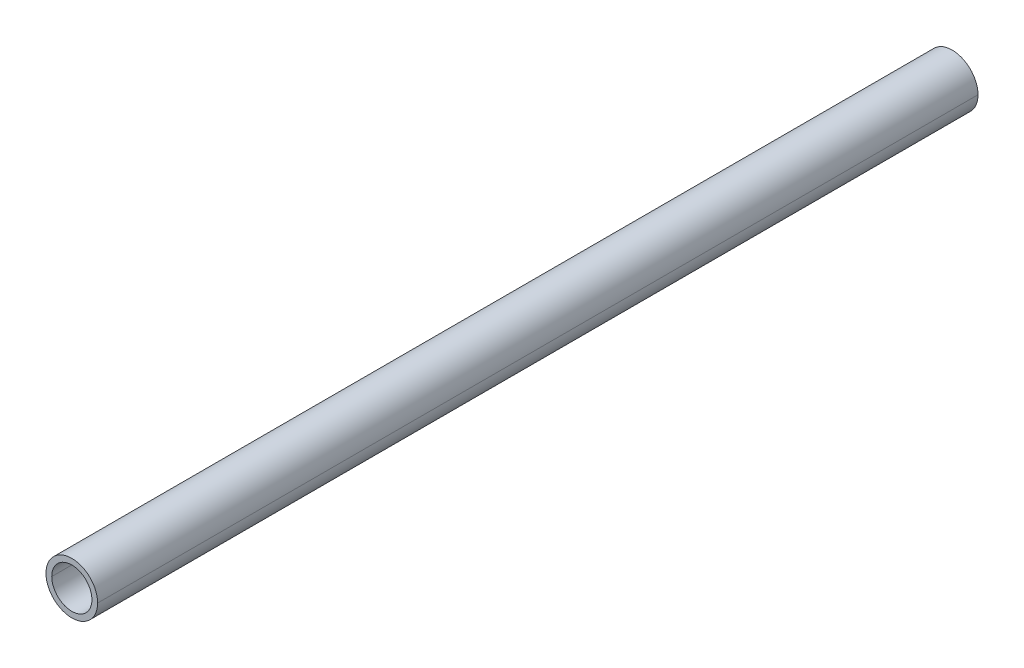
ISO-10303-21;
HEADER;
FILE_DESCRIPTION(('STEP AP214'),'2;1');
FILE_NAME('part.step','',(''),(''),'','','');
FILE_SCHEMA(('AUTOMOTIVE_DESIGN { 1 0 10303 214 1 1 1 1 }'));
ENDSEC;
DATA;
#1=APPLICATION_CONTEXT('core data for automotive mechanical design processes');
#2=APPLICATION_PROTOCOL_DEFINITION('international standard','automotive_design',2000,#1);
#3=PRODUCT_CONTEXT('',#1,'mechanical');
#4=PRODUCT('Part','Part','',(#3));
#5=PRODUCT_RELATED_PRODUCT_CATEGORY('part','',(#4));
#6=PRODUCT_DEFINITION_FORMATION('','',#4);
#7=PRODUCT_DEFINITION_CONTEXT('part definition',#1,'design');
#8=PRODUCT_DEFINITION('design','',#6,#7);
#9=PRODUCT_DEFINITION_SHAPE('','',#8);
#10=(LENGTH_UNIT() NAMED_UNIT(*) SI_UNIT(.MILLI.,.METRE.));
#11=(NAMED_UNIT(*) PLANE_ANGLE_UNIT() SI_UNIT($,.RADIAN.));
#12=(NAMED_UNIT(*) SI_UNIT($,.STERADIAN.) SOLID_ANGLE_UNIT());
#13=UNCERTAINTY_MEASURE_WITH_UNIT(LENGTH_MEASURE(1.E-05),#10,'distance_accuracy_value','');
#14=(GEOMETRIC_REPRESENTATION_CONTEXT(3) GLOBAL_UNCERTAINTY_ASSIGNED_CONTEXT((#13)) GLOBAL_UNIT_ASSIGNED_CONTEXT((#10,
#11,#12)) REPRESENTATION_CONTEXT('',''));
#15=CARTESIAN_POINT('',(0.,0.,0.));
#16=DIRECTION('',(0.,0.,1.));
#17=DIRECTION('',(1.,0.,0.));
#18=AXIS2_PLACEMENT_3D('',#15,#16,#17);
#19=CARTESIAN_POINT('',(0.,0.,306.9));
#20=DIRECTION('',(0.,0.,-1.));
#21=DIRECTION('',(-1.,0.,0.));
#22=AXIS2_PLACEMENT_3D('',#19,#20,#21);
#23=CYLINDRICAL_SURFACE('',#22,7.);
#24=DIRECTION('',(0.,0.,-1.));
#25=VECTOR('',#24,1.);
#26=CARTESIAN_POINT('',(7.,0.,306.9));
#27=LINE('',#26,#25);
#28=CARTESIAN_POINT('',(7.,0.,306.9));
#29=VERTEX_POINT('',#28);
#30=CARTESIAN_POINT('',(7.,0.,0.));
#31=VERTEX_POINT('',#30);
#32=EDGE_CURVE('E76',#29,#31,#27,.T.);
#33=ORIENTED_EDGE('',*,*,#32,.F.);
#34=CARTESIAN_POINT('',(0.,0.,306.9));
#35=DIRECTION('',(0.,0.,1.));
#36=DIRECTION('',(1.,0.,0.));
#37=AXIS2_PLACEMENT_3D('',#34,#35,#36);
#38=CIRCLE('',#37,7.);
#39=CARTESIAN_POINT('',(-7.,0.,306.9));
#40=VERTEX_POINT('',#39);
#41=EDGE_CURVE('E65',#29,#40,#38,.T.);
#42=ORIENTED_EDGE('',*,*,#41,.T.);
#43=DIRECTION('',(0.,0.,-1.));
#44=VECTOR('',#43,1.);
#45=CARTESIAN_POINT('',(-7.,0.,306.9));
#46=LINE('',#45,#44);
#47=CARTESIAN_POINT('',(-7.,0.,0.));
#48=VERTEX_POINT('',#47);
#49=EDGE_CURVE('E73',#40,#48,#46,.T.);
#50=ORIENTED_EDGE('',*,*,#49,.T.);
#51=CARTESIAN_POINT('',(0.,0.,0.));
#52=DIRECTION('',(0.,0.,1.));
#53=DIRECTION('',(1.,0.,0.));
#54=AXIS2_PLACEMENT_3D('',#51,#52,#53);
#55=CIRCLE('',#54,7.);
#56=EDGE_CURVE('E11',#31,#48,#55,.T.);
#57=ORIENTED_EDGE('',*,*,#56,.F.);
#58=EDGE_LOOP('',(#33,#42,#50,#57));
#59=FACE_BOUND('',#58,.T.);
#60=ADVANCED_FACE('F16',(#59),#23,.F.);
#61=CARTESIAN_POINT('',(0.,0.,306.9));
#62=DIRECTION('',(0.,0.,-1.));
#63=DIRECTION('',(-1.,0.,0.));
#64=AXIS2_PLACEMENT_3D('',#61,#62,#63);
#65=CYLINDRICAL_SURFACE('',#64,9.);
#66=DIRECTION('',(0.,0.,-1.));
#67=VECTOR('',#66,1.);
#68=CARTESIAN_POINT('',(9.,0.,306.9));
#69=LINE('',#68,#67);
#70=CARTESIAN_POINT('',(9.,0.,306.9));
#71=VERTEX_POINT('',#70);
#72=CARTESIAN_POINT('',(9.,0.,0.));
#73=VERTEX_POINT('',#72);
#74=EDGE_CURVE('E103',#71,#73,#69,.T.);
#75=ORIENTED_EDGE('',*,*,#74,.F.);
#76=CARTESIAN_POINT('',(0.,0.,306.9));
#77=DIRECTION('',(0.,0.,1.));
#78=DIRECTION('',(1.,0.,0.));
#79=AXIS2_PLACEMENT_3D('',#76,#77,#78);
#80=CIRCLE('',#79,9.);
#81=CARTESIAN_POINT('',(-9.,0.,306.9));
#82=VERTEX_POINT('',#81);
#83=EDGE_CURVE('E20',#82,#71,#80,.T.);
#84=ORIENTED_EDGE('',*,*,#83,.F.);
#85=DIRECTION('',(0.,0.,-1.));
#86=VECTOR('',#85,1.);
#87=CARTESIAN_POINT('',(-9.,0.,306.9));
#88=LINE('',#87,#86);
#89=CARTESIAN_POINT('',(-9.,0.,0.));
#90=VERTEX_POINT('',#89);
#91=EDGE_CURVE('E99',#82,#90,#88,.T.);
#92=ORIENTED_EDGE('',*,*,#91,.T.);
#93=CARTESIAN_POINT('',(0.,0.,0.));
#94=DIRECTION('',(0.,0.,1.));
#95=DIRECTION('',(1.,0.,0.));
#96=AXIS2_PLACEMENT_3D('',#93,#94,#95);
#97=CIRCLE('',#96,9.);
#98=EDGE_CURVE('E27',#90,#73,#97,.T.);
#99=ORIENTED_EDGE('',*,*,#98,.T.);
#100=EDGE_LOOP('',(#75,#84,#92,#99));
#101=FACE_BOUND('',#100,.T.);
#102=ADVANCED_FACE('F198',(#101),#65,.T.);
#103=CARTESIAN_POINT('',(0.,0.,0.));
#104=DIRECTION('',(0.,0.,1.));
#105=DIRECTION('',(1.,0.,0.));
#106=AXIS2_PLACEMENT_3D('',#103,#104,#105);
#107=PLANE('',#106);
#108=CARTESIAN_POINT('',(0.,0.,0.));
#109=DIRECTION('',(0.,0.,1.));
#110=DIRECTION('',(1.,0.,0.));
#111=AXIS2_PLACEMENT_3D('',#108,#109,#110);
#112=CIRCLE('',#111,7.);
#113=EDGE_CURVE('E84',#48,#31,#112,.T.);
#114=ORIENTED_EDGE('',*,*,#113,.T.);
#115=ORIENTED_EDGE('',*,*,#56,.T.);
#116=EDGE_LOOP('',(#114,#115));
#117=FACE_BOUND('',#116,.T.);
#118=ORIENTED_EDGE('',*,*,#98,.F.);
#119=CARTESIAN_POINT('',(0.,0.,0.));
#120=DIRECTION('',(0.,0.,1.));
#121=DIRECTION('',(1.,0.,0.));
#122=AXIS2_PLACEMENT_3D('',#119,#120,#121);
#123=CIRCLE('',#122,9.);
#124=EDGE_CURVE('E101',#73,#90,#123,.T.);
#125=ORIENTED_EDGE('',*,*,#124,.F.);
#126=EDGE_LOOP('',(#118,#125));
#127=FACE_BOUND('',#126,.T.);
#128=ADVANCED_FACE('F194',(#117,#127),#107,.F.);
#129=CARTESIAN_POINT('',(0.,0.,306.9));
#130=DIRECTION('',(0.,0.,1.));
#131=DIRECTION('',(1.,0.,0.));
#132=AXIS2_PLACEMENT_3D('',#129,#130,#131);
#133=PLANE('',#132);
#134=CARTESIAN_POINT('',(0.,0.,306.9));
#135=DIRECTION('',(0.,0.,1.));
#136=DIRECTION('',(1.,0.,0.));
#137=AXIS2_PLACEMENT_3D('',#134,#135,#136);
#138=CIRCLE('',#137,7.);
#139=EDGE_CURVE('E82',#40,#29,#138,.T.);
#140=ORIENTED_EDGE('',*,*,#139,.F.);
#141=ORIENTED_EDGE('',*,*,#41,.F.);
#142=EDGE_LOOP('',(#140,#141));
#143=FACE_BOUND('',#142,.T.);
#144=ORIENTED_EDGE('',*,*,#83,.T.);
#145=CARTESIAN_POINT('',(0.,0.,306.9));
#146=DIRECTION('',(0.,0.,1.));
#147=DIRECTION('',(1.,0.,0.));
#148=AXIS2_PLACEMENT_3D('',#145,#146,#147);
#149=CIRCLE('',#148,9.);
#150=EDGE_CURVE('E86',#71,#82,#149,.T.);
#151=ORIENTED_EDGE('',*,*,#150,.T.);
#152=EDGE_LOOP('',(#144,#151));
#153=FACE_BOUND('',#152,.T.);
#154=ADVANCED_FACE('F88',(#143,#153),#133,.T.);
#155=CARTESIAN_POINT('',(0.,0.,306.9));
#156=DIRECTION('',(0.,0.,-1.));
#157=DIRECTION('',(-1.,0.,0.));
#158=AXIS2_PLACEMENT_3D('',#155,#156,#157);
#159=CYLINDRICAL_SURFACE('',#158,9.);
#160=ORIENTED_EDGE('',*,*,#150,.F.);
#161=ORIENTED_EDGE('',*,*,#74,.T.);
#162=ORIENTED_EDGE('',*,*,#124,.T.);
#163=ORIENTED_EDGE('',*,*,#91,.F.);
#164=EDGE_LOOP('',(#160,#161,#162,#163));
#165=FACE_BOUND('',#164,.T.);
#166=ADVANCED_FACE('F18',(#165),#159,.T.);
#167=CARTESIAN_POINT('',(0.,0.,306.9));
#168=DIRECTION('',(0.,0.,-1.));
#169=DIRECTION('',(-1.,0.,0.));
#170=AXIS2_PLACEMENT_3D('',#167,#168,#169);
#171=CYLINDRICAL_SURFACE('',#170,7.);
#172=ORIENTED_EDGE('',*,*,#139,.T.);
#173=ORIENTED_EDGE('',*,*,#32,.T.);
#174=ORIENTED_EDGE('',*,*,#113,.F.);
#175=ORIENTED_EDGE('',*,*,#49,.F.);
#176=EDGE_LOOP('',(#172,#173,#174,#175));
#177=FACE_BOUND('',#176,.T.);
#178=ADVANCED_FACE('F81',(#177),#171,.F.);
#179=CLOSED_SHELL('',(#60,#102,#128,#154,#166,#178));
#180=MANIFOLD_SOLID_BREP('B1',#179);
#181=ADVANCED_BREP_SHAPE_REPRESENTATION('',(#18,#180),#14);
#182=SHAPE_DEFINITION_REPRESENTATION(#9,#181);
ENDSEC;
END-ISO-10303-21;
